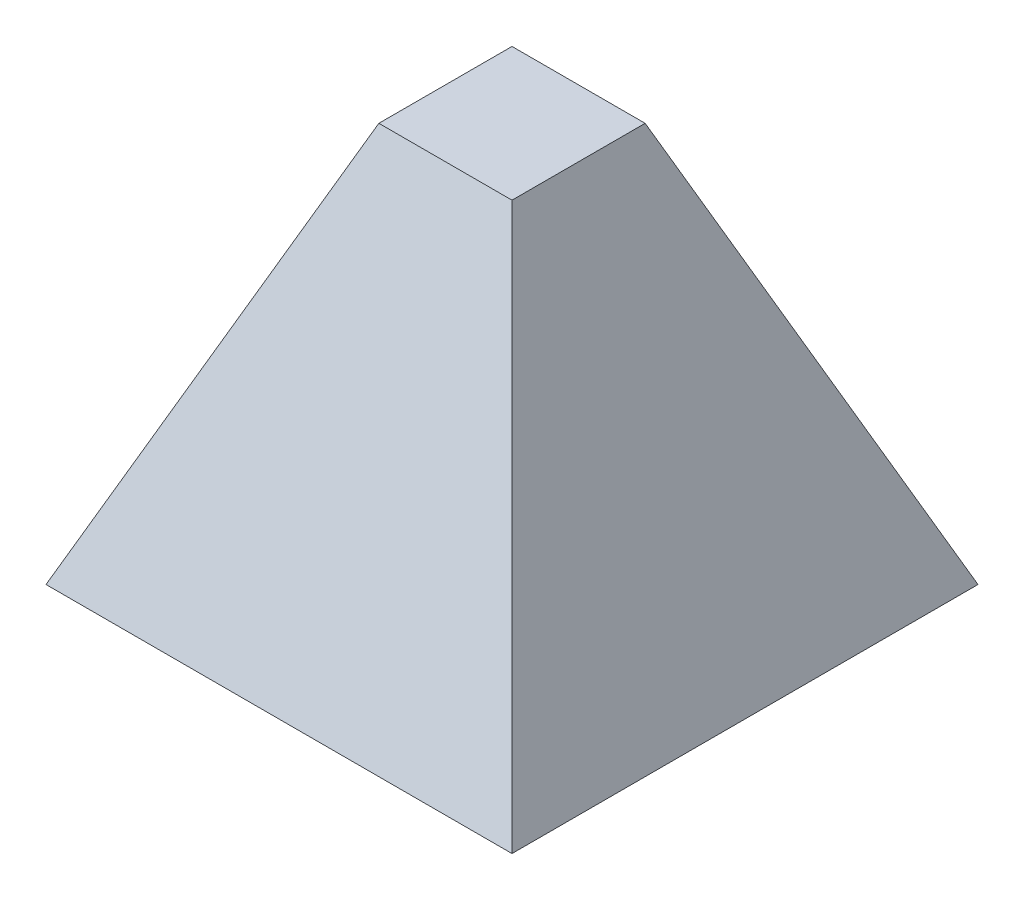
ISO-10303-21;
HEADER;
FILE_DESCRIPTION(('STEP AP214'),'2;1');
FILE_NAME('part.step','',(''),(''),'','','');
FILE_SCHEMA(('AUTOMOTIVE_DESIGN { 1 0 10303 214 1 1 1 1 }'));
ENDSEC;
DATA;
#1=APPLICATION_CONTEXT('core data for automotive mechanical design processes');
#2=APPLICATION_PROTOCOL_DEFINITION('international standard','automotive_design',2000,#1);
#3=PRODUCT_CONTEXT('',#1,'mechanical');
#4=PRODUCT('Part','Part','',(#3));
#5=PRODUCT_RELATED_PRODUCT_CATEGORY('part','',(#4));
#6=PRODUCT_DEFINITION_FORMATION('','',#4);
#7=PRODUCT_DEFINITION_CONTEXT('part definition',#1,'design');
#8=PRODUCT_DEFINITION('design','',#6,#7);
#9=PRODUCT_DEFINITION_SHAPE('','',#8);
#10=(LENGTH_UNIT() NAMED_UNIT(*) SI_UNIT(.MILLI.,.METRE.));
#11=(NAMED_UNIT(*) PLANE_ANGLE_UNIT() SI_UNIT($,.RADIAN.));
#12=(NAMED_UNIT(*) SI_UNIT($,.STERADIAN.) SOLID_ANGLE_UNIT());
#13=UNCERTAINTY_MEASURE_WITH_UNIT(LENGTH_MEASURE(1.E-05),#10,'distance_accuracy_value','');
#14=(GEOMETRIC_REPRESENTATION_CONTEXT(3) GLOBAL_UNCERTAINTY_ASSIGNED_CONTEXT((#13)) GLOBAL_UNIT_ASSIGNED_CONTEXT((#10,
#11,#12)) REPRESENTATION_CONTEXT('',''));
#15=CARTESIAN_POINT('',(0.,0.,0.));
#16=DIRECTION('',(0.,0.,1.));
#17=DIRECTION('',(1.,0.,0.));
#18=AXIS2_PLACEMENT_3D('',#15,#16,#17);
#19=CARTESIAN_POINT('',(-66.9999999999998,0.,67.));
#20=DIRECTION('',(-0.923076923063769,0.384615384646956,0.));
#21=DIRECTION('',(-0.384615384646956,-0.923076923063769,0.));
#22=AXIS2_PLACEMENT_3D('',#19,#20,#21);
#23=PLANE('',#22);
#24=DIRECTION('',(0.,0.,1.));
#25=VECTOR('',#24,1.);
#26=CARTESIAN_POINT('',(-66.9999999999998,0.,67.));
#27=LINE('',#26,#25);
#28=CARTESIAN_POINT('',(-67.0000000000002,0.,-67.));
#29=VERTEX_POINT('',#28);
#30=CARTESIAN_POINT('',(-66.9999999999998,0.,67.));
#31=VERTEX_POINT('',#30);
#32=EDGE_CURVE('E97',#29,#31,#27,.T.);
#33=ORIENTED_EDGE('',*,*,#32,.T.);
#34=DIRECTION('',(-0.358979079334537,-0.861549790319895,0.358979079334539));
#35=VECTOR('',#34,1.);
#36=CARTESIAN_POINT('',(-66.9999999999998,0.,67.));
#37=LINE('',#36,#35);
#38=CARTESIAN_POINT('',(-62.8333333329317,10.,62.8333333329319));
#39=VERTEX_POINT('',#38);
#40=EDGE_CURVE('E12',#39,#31,#37,.T.);
#41=ORIENTED_EDGE('',*,*,#40,.F.);
#42=DIRECTION('',(0.,0.,-1.));
#43=VECTOR('',#42,1.);
#44=CARTESIAN_POINT('',(-62.8333333329319,10.,2.21250602138594E-13));
#45=LINE('',#44,#43);
#46=CARTESIAN_POINT('',(-62.8333333329322,10.,-62.8333333329319));
#47=VERTEX_POINT('',#46);
#48=EDGE_CURVE('E113',#47,#39,#45,.F.);
#49=ORIENTED_EDGE('',*,*,#48,.F.);
#50=DIRECTION('',(-0.35897907933454,-0.861549790319894,-0.358979079334538));
#51=VECTOR('',#50,1.);
#52=CARTESIAN_POINT('',(-49.7319587604172,41.4432989710068,-49.731958760417));
#53=LINE('',#52,#51);
#54=EDGE_CURVE('E108',#47,#29,#53,.T.);
#55=ORIENTED_EDGE('',*,*,#54,.T.);
#56=EDGE_LOOP('',(#33,#41,#49,#55));
#57=FACE_BOUND('',#56,.T.);
#58=ADVANCED_FACE('F51',(#57),#23,.T.);
#59=CARTESIAN_POINT('',(-66.9999999999998,0.,67.));
#60=DIRECTION('',(0.,0.384615384646956,0.923076923063769));
#61=DIRECTION('',(0.,-0.923076923063769,0.384615384646956));
#62=AXIS2_PLACEMENT_3D('',#59,#60,#61);
#63=PLANE('',#62);
#64=DIRECTION('',(1.,0.,0.));
#65=VECTOR('',#64,1.);
#66=CARTESIAN_POINT('',(-66.9999999999998,0.,67.));
#67=LINE('',#66,#65);
#68=CARTESIAN_POINT('',(67.0000000000002,0.,67.));
#69=VERTEX_POINT('',#68);
#70=EDGE_CURVE('E93',#31,#69,#67,.T.);
#71=ORIENTED_EDGE('',*,*,#70,.T.);
#72=DIRECTION('',(0.35897907933454,-0.861549790319894,0.358979079334538));
#73=VECTOR('',#72,1.);
#74=CARTESIAN_POINT('',(49.7319587604172,41.4432989710068,49.731958760417));
#75=LINE('',#74,#73);
#76=CARTESIAN_POINT('',(62.8333333329322,10.,62.8333333329319));
#77=VERTEX_POINT('',#76);
#78=EDGE_CURVE('E60',#77,#69,#75,.T.);
#79=ORIENTED_EDGE('',*,*,#78,.F.);
#80=DIRECTION('',(-1.,0.,0.));
#81=VECTOR('',#80,1.);
#82=CARTESIAN_POINT('',(0.,10.,62.8333333329319));
#83=LINE('',#82,#81);
#84=EDGE_CURVE('E104',#39,#77,#83,.F.);
#85=ORIENTED_EDGE('',*,*,#84,.F.);
#86=ORIENTED_EDGE('',*,*,#40,.T.);
#87=EDGE_LOOP('',(#71,#79,#85,#86));
#88=FACE_BOUND('',#87,.T.);
#89=ADVANCED_FACE('F53',(#88),#63,.T.);
#90=CARTESIAN_POINT('',(66.9999999999998,0.,-67.));
#91=DIRECTION('',(0.923076923063769,0.384615384646956,0.));
#92=DIRECTION('',(-0.384615384646956,0.923076923063769,0.));
#93=AXIS2_PLACEMENT_3D('',#90,#91,#92);
#94=PLANE('',#93);
#95=DIRECTION('',(0.,0.,-1.));
#96=VECTOR('',#95,1.);
#97=CARTESIAN_POINT('',(66.9999999999998,0.,-67.));
#98=LINE('',#97,#96);
#99=CARTESIAN_POINT('',(66.9999999999998,0.,-67.));
#100=VERTEX_POINT('',#99);
#101=EDGE_CURVE('E98',#69,#100,#98,.T.);
#102=ORIENTED_EDGE('',*,*,#101,.T.);
#103=DIRECTION('',(0.358979079334537,-0.861549790319895,-0.358979079334539));
#104=VECTOR('',#103,1.);
#105=CARTESIAN_POINT('',(49.7319587604169,41.4432989710065,-49.7319587604171));
#106=LINE('',#105,#104);
#107=CARTESIAN_POINT('',(62.8333333329317,10.,-62.8333333329319));
#108=VERTEX_POINT('',#107);
#109=EDGE_CURVE('E116',#108,#100,#106,.T.);
#110=ORIENTED_EDGE('',*,*,#109,.F.);
#111=DIRECTION('',(0.,0.,1.));
#112=VECTOR('',#111,1.);
#113=CARTESIAN_POINT('',(62.8333333329319,10.,-2.21250602138594E-13));
#114=LINE('',#113,#112);
#115=EDGE_CURVE('E72',#77,#108,#114,.F.);
#116=ORIENTED_EDGE('',*,*,#115,.F.);
#117=ORIENTED_EDGE('',*,*,#78,.T.);
#118=EDGE_LOOP('',(#102,#110,#116,#117));
#119=FACE_BOUND('',#118,.T.);
#120=ADVANCED_FACE('F123',(#119),#94,.T.);
#121=CARTESIAN_POINT('',(-67.0000000000002,0.,-67.));
#122=DIRECTION('',(0.,0.384615384646956,-0.923076923063769));
#123=DIRECTION('',(0.,0.923076923063769,0.384615384646956));
#124=AXIS2_PLACEMENT_3D('',#121,#122,#123);
#125=PLANE('',#124);
#126=DIRECTION('',(-1.,0.,0.));
#127=VECTOR('',#126,1.);
#128=CARTESIAN_POINT('',(-67.0000000000002,0.,-67.));
#129=LINE('',#128,#127);
#130=EDGE_CURVE('E112',#100,#29,#129,.T.);
#131=ORIENTED_EDGE('',*,*,#130,.T.);
#132=ORIENTED_EDGE('',*,*,#54,.F.);
#133=DIRECTION('',(1.,0.,0.));
#134=VECTOR('',#133,1.);
#135=CARTESIAN_POINT('',(0.,10.,-62.8333333329319));
#136=LINE('',#135,#134);
#137=EDGE_CURVE('E55',#108,#47,#136,.F.);
#138=ORIENTED_EDGE('',*,*,#137,.F.);
#139=ORIENTED_EDGE('',*,*,#109,.T.);
#140=EDGE_LOOP('',(#131,#132,#138,#139));
#141=FACE_BOUND('',#140,.T.);
#142=ADVANCED_FACE('F125',(#141),#125,.T.);
#143=CARTESIAN_POINT('',(0.,10.,0.));
#144=DIRECTION('',(0.,-1.,0.));
#145=DIRECTION('',(0.,0.,-1.));
#146=AXIS2_PLACEMENT_3D('',#143,#144,#145);
#147=PLANE('',#146);
#148=ORIENTED_EDGE('',*,*,#48,.T.);
#149=ORIENTED_EDGE('',*,*,#84,.T.);
#150=ORIENTED_EDGE('',*,*,#115,.T.);
#151=ORIENTED_EDGE('',*,*,#137,.T.);
#152=EDGE_LOOP('',(#148,#149,#150,#151));
#153=FACE_BOUND('',#152,.T.);
#154=ADVANCED_FACE('F121',(#153),#147,.F.);
#155=CARTESIAN_POINT('',(0.,0.,0.));
#156=DIRECTION('',(0.,-1.,0.));
#157=DIRECTION('',(0.,0.,-1.));
#158=AXIS2_PLACEMENT_3D('',#155,#156,#157);
#159=PLANE('',#158);
#160=ORIENTED_EDGE('',*,*,#32,.F.);
#161=ORIENTED_EDGE('',*,*,#130,.F.);
#162=ORIENTED_EDGE('',*,*,#101,.F.);
#163=ORIENTED_EDGE('',*,*,#70,.F.);
#164=EDGE_LOOP('',(#160,#161,#162,#163));
#165=FACE_BOUND('',#164,.T.);
#166=ADVANCED_FACE('F94',(#165),#159,.T.);
#167=CLOSED_SHELL('',(#58,#89,#120,#142,#154,#166));
#168=MANIFOLD_SOLID_BREP('B2',#167);
#169=CARTESIAN_POINT('',(0.,0.,0.));
#170=DIRECTION('',(0.,-1.,0.));
#171=DIRECTION('',(0.,0.,-1.));
#172=AXIS2_PLACEMENT_3D('',#169,#170,#171);
#173=PLANE('',#172);
#174=DIRECTION('',(0.,0.,1.));
#175=VECTOR('',#174,1.);
#176=CARTESIAN_POINT('',(-70.,0.,70.));
#177=LINE('',#176,#175);
#178=CARTESIAN_POINT('',(-70.,0.,-70.));
#179=VERTEX_POINT('',#178);
#180=CARTESIAN_POINT('',(-70.,0.,70.));
#181=VERTEX_POINT('',#180);
#182=EDGE_CURVE('E276',#179,#181,#177,.T.);
#183=ORIENTED_EDGE('',*,*,#182,.F.);
#184=DIRECTION('',(-1.,0.,0.));
#185=VECTOR('',#184,1.);
#186=CARTESIAN_POINT('',(-70.,0.,-70.));
#187=LINE('',#186,#185);
#188=CARTESIAN_POINT('',(70.,0.,-70.));
#189=VERTEX_POINT('',#188);
#190=EDGE_CURVE('E299',#189,#179,#187,.T.);
#191=ORIENTED_EDGE('',*,*,#190,.F.);
#192=DIRECTION('',(0.,0.,-1.));
#193=VECTOR('',#192,1.);
#194=CARTESIAN_POINT('',(70.,0.,70.));
#195=LINE('',#194,#193);
#196=CARTESIAN_POINT('',(70.,0.,70.));
#197=VERTEX_POINT('',#196);
#198=EDGE_CURVE('E297',#197,#189,#195,.T.);
#199=ORIENTED_EDGE('',*,*,#198,.F.);
#200=DIRECTION('',(1.,0.,0.));
#201=VECTOR('',#200,1.);
#202=CARTESIAN_POINT('',(-70.,0.,70.));
#203=LINE('',#202,#201);
#204=EDGE_CURVE('E280',#181,#197,#203,.T.);
#205=ORIENTED_EDGE('',*,*,#204,.F.);
#206=EDGE_LOOP('',(#183,#191,#199,#205));
#207=FACE_BOUND('',#206,.T.);
#208=DIRECTION('',(1.,0.,0.));
#209=VECTOR('',#208,1.);
#210=CARTESIAN_POINT('',(0.,0.,-66.7499999999537));
#211=LINE('',#210,#209);
#212=CARTESIAN_POINT('',(66.7499999999537,0.,-66.7499999999537));
#213=VERTEX_POINT('',#212);
#214=CARTESIAN_POINT('',(-66.7499999999537,0.,-66.7499999999537));
#215=VERTEX_POINT('',#214);
#216=EDGE_CURVE('E271',#213,#215,#211,.F.);
#217=ORIENTED_EDGE('',*,*,#216,.T.);
#218=DIRECTION('',(0.,0.,-1.));
#219=VECTOR('',#218,1.);
#220=CARTESIAN_POINT('',(-66.7499999999537,0.,0.));
#221=LINE('',#220,#219);
#222=CARTESIAN_POINT('',(-66.7499999999537,0.,66.7499999999537));
#223=VERTEX_POINT('',#222);
#224=EDGE_CURVE('E290',#215,#223,#221,.F.);
#225=ORIENTED_EDGE('',*,*,#224,.T.);
#226=DIRECTION('',(-1.,0.,0.));
#227=VECTOR('',#226,1.);
#228=CARTESIAN_POINT('',(0.,0.,66.7499999999537));
#229=LINE('',#228,#227);
#230=CARTESIAN_POINT('',(66.7499999999537,0.,66.7499999999537));
#231=VERTEX_POINT('',#230);
#232=EDGE_CURVE('E275',#223,#231,#229,.F.);
#233=ORIENTED_EDGE('',*,*,#232,.T.);
#234=DIRECTION('',(0.,0.,1.));
#235=VECTOR('',#234,1.);
#236=CARTESIAN_POINT('',(66.7499999999537,0.,0.));
#237=LINE('',#236,#235);
#238=EDGE_CURVE('E203',#231,#213,#237,.F.);
#239=ORIENTED_EDGE('',*,*,#238,.T.);
#240=EDGE_LOOP('',(#217,#225,#233,#239));
#241=FACE_BOUND('',#240,.T.);
#242=ADVANCED_FACE('F186',(#207,#241),#173,.T.);
#243=CARTESIAN_POINT('',(-70.,0.,70.));
#244=DIRECTION('',(-0.923076923063769,0.384615384646956,0.));
#245=DIRECTION('',(-0.384615384646956,-0.923076923063769,0.));
#246=AXIS2_PLACEMENT_3D('',#243,#244,#245);
#247=PLANE('',#246);
#248=ORIENTED_EDGE('',*,*,#182,.T.);
#249=DIRECTION('',(-0.358979079334538,-0.861549790319895,0.358979079334538));
#250=VECTOR('',#249,1.);
#251=CARTESIAN_POINT('',(-70.,0.,70.));
#252=LINE('',#251,#250);
#253=CARTESIAN_POINT('',(-19.9999999951832,120.,19.9999999951832));
#254=VERTEX_POINT('',#253);
#255=EDGE_CURVE('E49',#254,#181,#252,.T.);
#256=ORIENTED_EDGE('',*,*,#255,.F.);
#257=DIRECTION('',(0.,0.,-1.));
#258=VECTOR('',#257,1.);
#259=CARTESIAN_POINT('',(-19.9999999951832,120.,0.));
#260=LINE('',#259,#258);
#261=CARTESIAN_POINT('',(-19.9999999951832,120.,-19.9999999951832));
#262=VERTEX_POINT('',#261);
#263=EDGE_CURVE('E300',#262,#254,#260,.F.);
#264=ORIENTED_EDGE('',*,*,#263,.F.);
#265=DIRECTION('',(-0.358979079334538,-0.861549790319895,-0.358979079334538));
#266=VECTOR('',#265,1.);
#267=CARTESIAN_POINT('',(-51.9587628840178,43.2989690741861,-51.9587628840178));
#268=LINE('',#267,#266);
#269=EDGE_CURVE('E302',#262,#179,#268,.T.);
#270=ORIENTED_EDGE('',*,*,#269,.T.);
#271=EDGE_LOOP('',(#248,#256,#264,#270));
#272=FACE_BOUND('',#271,.T.);
#273=ADVANCED_FACE('F327',(#272),#247,.T.);
#274=CARTESIAN_POINT('',(-70.,0.,70.));
#275=DIRECTION('',(0.,0.384615384646956,0.923076923063769));
#276=DIRECTION('',(0.,-0.923076923063769,0.384615384646956));
#277=AXIS2_PLACEMENT_3D('',#274,#275,#276);
#278=PLANE('',#277);
#279=ORIENTED_EDGE('',*,*,#204,.T.);
#280=DIRECTION('',(0.358979079334538,-0.861549790319895,0.358979079334538));
#281=VECTOR('',#280,1.);
#282=CARTESIAN_POINT('',(70.,0.,70.));
#283=LINE('',#282,#281);
#284=CARTESIAN_POINT('',(19.9999999951832,120.,19.9999999951832));
#285=VERTEX_POINT('',#284);
#286=EDGE_CURVE('E195',#285,#197,#283,.T.);
#287=ORIENTED_EDGE('',*,*,#286,.F.);
#288=DIRECTION('',(-1.,0.,0.));
#289=VECTOR('',#288,1.);
#290=CARTESIAN_POINT('',(0.,120.,19.9999999951832));
#291=LINE('',#290,#289);
#292=EDGE_CURVE('E311',#254,#285,#291,.F.);
#293=ORIENTED_EDGE('',*,*,#292,.F.);
#294=ORIENTED_EDGE('',*,*,#255,.T.);
#295=EDGE_LOOP('',(#279,#287,#293,#294));
#296=FACE_BOUND('',#295,.T.);
#297=ADVANCED_FACE('F188',(#296),#278,.T.);
#298=CARTESIAN_POINT('',(70.,0.,70.));
#299=DIRECTION('',(0.923076923063769,0.384615384646956,0.));
#300=DIRECTION('',(-0.384615384646956,0.923076923063769,0.));
#301=AXIS2_PLACEMENT_3D('',#298,#299,#300);
#302=PLANE('',#301);
#303=ORIENTED_EDGE('',*,*,#198,.T.);
#304=DIRECTION('',(0.358979079334538,-0.861549790319895,-0.358979079334538));
#305=VECTOR('',#304,1.);
#306=CARTESIAN_POINT('',(51.9587628840178,43.2989690741861,-51.9587628840178));
#307=LINE('',#306,#305);
#308=CARTESIAN_POINT('',(19.9999999951832,120.,-19.9999999951832));
#309=VERTEX_POINT('',#308);
#310=EDGE_CURVE('E305',#309,#189,#307,.T.);
#311=ORIENTED_EDGE('',*,*,#310,.F.);
#312=DIRECTION('',(0.,0.,1.));
#313=VECTOR('',#312,1.);
#314=CARTESIAN_POINT('',(19.9999999951832,120.,0.));
#315=LINE('',#314,#313);
#316=EDGE_CURVE('E312',#285,#309,#315,.F.);
#317=ORIENTED_EDGE('',*,*,#316,.F.);
#318=ORIENTED_EDGE('',*,*,#286,.T.);
#319=EDGE_LOOP('',(#303,#311,#317,#318));
#320=FACE_BOUND('',#319,.T.);
#321=ADVANCED_FACE('F318',(#320),#302,.T.);
#322=CARTESIAN_POINT('',(-70.,0.,-70.));
#323=DIRECTION('',(0.,0.384615384646956,-0.923076923063769));
#324=DIRECTION('',(0.,0.923076923063769,0.384615384646956));
#325=AXIS2_PLACEMENT_3D('',#322,#323,#324);
#326=PLANE('',#325);
#327=ORIENTED_EDGE('',*,*,#190,.T.);
#328=ORIENTED_EDGE('',*,*,#269,.F.);
#329=DIRECTION('',(1.,0.,0.));
#330=VECTOR('',#329,1.);
#331=CARTESIAN_POINT('',(0.,120.,-19.9999999951832));
#332=LINE('',#331,#330);
#333=EDGE_CURVE('E190',#309,#262,#332,.F.);
#334=ORIENTED_EDGE('',*,*,#333,.F.);
#335=ORIENTED_EDGE('',*,*,#310,.T.);
#336=EDGE_LOOP('',(#327,#328,#334,#335));
#337=FACE_BOUND('',#336,.T.);
#338=ADVANCED_FACE('F322',(#337),#326,.T.);
#339=CARTESIAN_POINT('',(0.,120.,0.));
#340=DIRECTION('',(0.,-1.,0.));
#341=DIRECTION('',(0.,0.,-1.));
#342=AXIS2_PLACEMENT_3D('',#339,#340,#341);
#343=PLANE('',#342);
#344=ORIENTED_EDGE('',*,*,#263,.T.);
#345=ORIENTED_EDGE('',*,*,#292,.T.);
#346=ORIENTED_EDGE('',*,*,#316,.T.);
#347=ORIENTED_EDGE('',*,*,#333,.T.);
#348=EDGE_LOOP('',(#344,#345,#346,#347));
#349=FACE_BOUND('',#348,.T.);
#350=ADVANCED_FACE('F315',(#349),#343,.F.);
#351=CARTESIAN_POINT('',(-67.2307692308087,-1.15384615394087,70.));
#352=DIRECTION('',(-0.923076923063769,0.384615384646956,0.));
#353=DIRECTION('',(-0.384615384646956,-0.923076923063769,0.));
#354=AXIS2_PLACEMENT_3D('',#351,#352,#353);
#355=PLANE('',#354);
#356=ORIENTED_EDGE('',*,*,#224,.F.);
#357=DIRECTION('',(-0.358979079334538,-0.861549790319895,-0.358979079334538));
#358=VECTOR('',#357,1.);
#359=CARTESIAN_POINT('',(-49.5463917500826,41.2886597957131,-49.5463917500826));
#360=LINE('',#359,#358);
#361=CARTESIAN_POINT('',(-17.9999999952573,117.,-17.9999999952573));
#362=VERTEX_POINT('',#361);
#363=EDGE_CURVE('E270',#362,#215,#360,.T.);
#364=ORIENTED_EDGE('',*,*,#363,.F.);
#365=DIRECTION('',(0.,0.,-1.));
#366=VECTOR('',#365,1.);
#367=CARTESIAN_POINT('',(-17.9999999952573,117.,0.));
#368=LINE('',#367,#366);
#369=CARTESIAN_POINT('',(-17.9999999952573,117.,17.9999999952573));
#370=VERTEX_POINT('',#369);
#371=EDGE_CURVE('E258',#362,#370,#368,.F.);
#372=ORIENTED_EDGE('',*,*,#371,.T.);
#373=DIRECTION('',(-0.358979079334538,-0.861549790319895,0.358979079334538));
#374=VECTOR('',#373,1.);
#375=CARTESIAN_POINT('',(-67.5876288660648,-2.010309278473,67.5876288660648));
#376=LINE('',#375,#374);
#377=EDGE_CURVE('E268',#370,#223,#376,.T.);
#378=ORIENTED_EDGE('',*,*,#377,.T.);
#379=EDGE_LOOP('',(#356,#364,#372,#378));
#380=FACE_BOUND('',#379,.T.);
#381=ADVANCED_FACE('F267',(#380),#355,.F.);
#382=CARTESIAN_POINT('',(-70.,-1.15384615394087,67.2307692308087));
#383=DIRECTION('',(0.,0.384615384646956,0.923076923063769));
#384=DIRECTION('',(0.,-0.923076923063769,0.384615384646956));
#385=AXIS2_PLACEMENT_3D('',#382,#383,#384);
#386=PLANE('',#385);
#387=ORIENTED_EDGE('',*,*,#232,.F.);
#388=ORIENTED_EDGE('',*,*,#377,.F.);
#389=DIRECTION('',(-1.,0.,0.));
#390=VECTOR('',#389,1.);
#391=CARTESIAN_POINT('',(0.,117.,17.9999999952573));
#392=LINE('',#391,#390);
#393=CARTESIAN_POINT('',(17.9999999952573,117.,17.9999999952573));
#394=VERTEX_POINT('',#393);
#395=EDGE_CURVE('E254',#370,#394,#392,.F.);
#396=ORIENTED_EDGE('',*,*,#395,.T.);
#397=DIRECTION('',(0.358979079334538,-0.861549790319895,0.358979079334538));
#398=VECTOR('',#397,1.);
#399=CARTESIAN_POINT('',(67.5876288660648,-2.010309278473,67.5876288660648));
#400=LINE('',#399,#398);
#401=EDGE_CURVE('E277',#394,#231,#400,.T.);
#402=ORIENTED_EDGE('',*,*,#401,.T.);
#403=EDGE_LOOP('',(#387,#388,#396,#402));
#404=FACE_BOUND('',#403,.T.);
#405=ADVANCED_FACE('F273',(#404),#386,.F.);
#406=CARTESIAN_POINT('',(67.2307692308087,-1.15384615394087,70.));
#407=DIRECTION('',(0.923076923063769,0.384615384646956,0.));
#408=DIRECTION('',(-0.384615384646956,0.923076923063769,0.));
#409=AXIS2_PLACEMENT_3D('',#406,#407,#408);
#410=PLANE('',#409);
#411=ORIENTED_EDGE('',*,*,#238,.F.);
#412=ORIENTED_EDGE('',*,*,#401,.F.);
#413=DIRECTION('',(0.,0.,1.));
#414=VECTOR('',#413,1.);
#415=CARTESIAN_POINT('',(17.9999999952573,117.,0.));
#416=LINE('',#415,#414);
#417=CARTESIAN_POINT('',(17.9999999952573,117.,-17.9999999952573));
#418=VERTEX_POINT('',#417);
#419=EDGE_CURVE('E259',#394,#418,#416,.F.);
#420=ORIENTED_EDGE('',*,*,#419,.T.);
#421=DIRECTION('',(0.358979079334538,-0.861549790319895,-0.358979079334538));
#422=VECTOR('',#421,1.);
#423=CARTESIAN_POINT('',(49.5463917500826,41.2886597957131,-49.5463917500826));
#424=LINE('',#423,#422);
#425=EDGE_CURVE('E282',#418,#213,#424,.T.);
#426=ORIENTED_EDGE('',*,*,#425,.T.);
#427=EDGE_LOOP('',(#411,#412,#420,#426));
#428=FACE_BOUND('',#427,.T.);
#429=ADVANCED_FACE('F337',(#428),#410,.F.);
#430=CARTESIAN_POINT('',(-70.,-1.15384615394087,-67.2307692308087));
#431=DIRECTION('',(0.,0.384615384646956,-0.923076923063769));
#432=DIRECTION('',(0.,0.923076923063769,0.384615384646956));
#433=AXIS2_PLACEMENT_3D('',#430,#431,#432);
#434=PLANE('',#433);
#435=ORIENTED_EDGE('',*,*,#216,.F.);
#436=ORIENTED_EDGE('',*,*,#425,.F.);
#437=DIRECTION('',(1.,0.,0.));
#438=VECTOR('',#437,1.);
#439=CARTESIAN_POINT('',(0.,117.,-17.9999999952573));
#440=LINE('',#439,#438);
#441=EDGE_CURVE('E285',#418,#362,#440,.F.);
#442=ORIENTED_EDGE('',*,*,#441,.T.);
#443=ORIENTED_EDGE('',*,*,#363,.T.);
#444=EDGE_LOOP('',(#435,#436,#442,#443));
#445=FACE_BOUND('',#444,.T.);
#446=ADVANCED_FACE('F336',(#445),#434,.F.);
#447=CARTESIAN_POINT('',(0.,117.,0.));
#448=DIRECTION('',(0.,-1.,0.));
#449=DIRECTION('',(0.,0.,-1.));
#450=AXIS2_PLACEMENT_3D('',#447,#448,#449);
#451=PLANE('',#450);
#452=ORIENTED_EDGE('',*,*,#371,.F.);
#453=ORIENTED_EDGE('',*,*,#441,.F.);
#454=ORIENTED_EDGE('',*,*,#419,.F.);
#455=ORIENTED_EDGE('',*,*,#395,.F.);
#456=EDGE_LOOP('',(#452,#453,#454,#455));
#457=FACE_BOUND('',#456,.T.);
#458=ADVANCED_FACE('F256',(#457),#451,.T.);
#459=CLOSED_SHELL('',(#242,#273,#297,#321,#338,#350,#381,#405,#429,#446,#458));
#460=MANIFOLD_SOLID_BREP('B6',#459);
#461=ADVANCED_BREP_SHAPE_REPRESENTATION('',(#18,#168,#460),#14);
#462=SHAPE_DEFINITION_REPRESENTATION(#9,#461);
ENDSEC;
END-ISO-10303-21;
